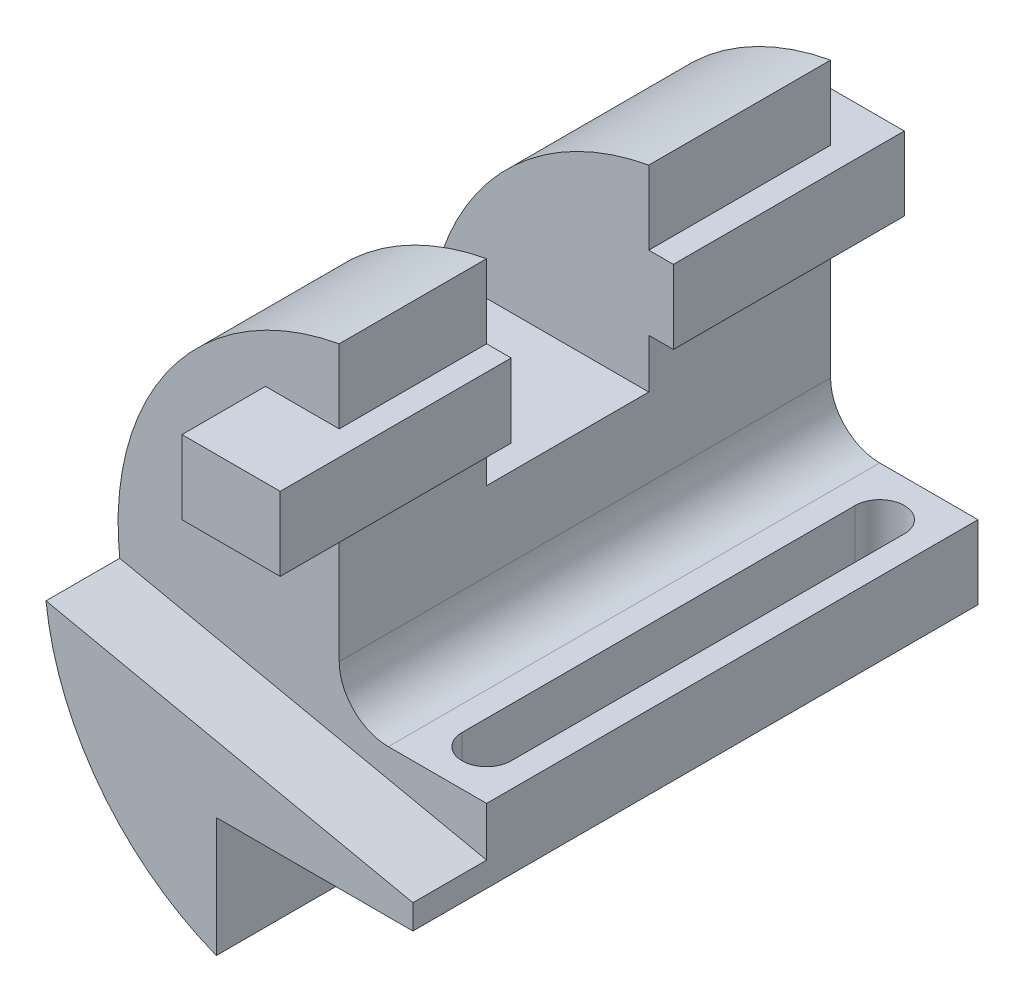
ISO-10303-21;
HEADER;
FILE_DESCRIPTION(('STEP AP214'),'2;1');
FILE_NAME('part.step','',(''),(''),'','','');
FILE_SCHEMA(('AUTOMOTIVE_DESIGN { 1 0 10303 214 1 1 1 1 }'));
ENDSEC;
DATA;
#1=APPLICATION_CONTEXT('core data for automotive mechanical design processes');
#2=APPLICATION_PROTOCOL_DEFINITION('international standard','automotive_design',2000,#1);
#3=PRODUCT_CONTEXT('',#1,'mechanical');
#4=PRODUCT('Part','Part','',(#3));
#5=PRODUCT_RELATED_PRODUCT_CATEGORY('part','',(#4));
#6=PRODUCT_DEFINITION_FORMATION('','',#4);
#7=PRODUCT_DEFINITION_CONTEXT('part definition',#1,'design');
#8=PRODUCT_DEFINITION('design','',#6,#7);
#9=PRODUCT_DEFINITION_SHAPE('','',#8);
#10=(LENGTH_UNIT() NAMED_UNIT(*) SI_UNIT(.MILLI.,.METRE.));
#11=(NAMED_UNIT(*) PLANE_ANGLE_UNIT() SI_UNIT($,.RADIAN.));
#12=(NAMED_UNIT(*) SI_UNIT($,.STERADIAN.) SOLID_ANGLE_UNIT());
#13=UNCERTAINTY_MEASURE_WITH_UNIT(LENGTH_MEASURE(1.E-05),#10,'distance_accuracy_value','');
#14=(GEOMETRIC_REPRESENTATION_CONTEXT(3) GLOBAL_UNCERTAINTY_ASSIGNED_CONTEXT((#13)) GLOBAL_UNIT_ASSIGNED_CONTEXT((#10,
#11,#12)) REPRESENTATION_CONTEXT('',''));
#15=CARTESIAN_POINT('',(0.,0.,0.));
#16=DIRECTION('',(0.,0.,1.));
#17=DIRECTION('',(1.,0.,0.));
#18=AXIS2_PLACEMENT_3D('',#15,#16,#17);
#19=CARTESIAN_POINT('',(-10.,-1.91673086804009,115.));
#20=DIRECTION('',(-1.,0.,0.));
#21=DIRECTION('',(0.,-1.,0.));
#22=AXIS2_PLACEMENT_3D('',#19,#20,#21);
#23=PLANE('',#22);
#24=DIRECTION('',(0.,1.,0.));
#25=VECTOR('',#24,1.);
#26=CARTESIAN_POINT('',(-10.,54.0832691319598,100.));
#27=LINE('',#26,#25);
#28=CARTESIAN_POINT('',(-10.,39.0832691319598,100.));
#29=VERTEX_POINT('',#28);
#30=CARTESIAN_POINT('',(-10.,54.0832691319598,100.));
#31=VERTEX_POINT('',#30);
#32=EDGE_CURVE('E380',#29,#31,#27,.T.);
#33=ORIENTED_EDGE('',*,*,#32,.F.);
#34=DIRECTION('',(0.,0.,-1.));
#35=VECTOR('',#34,1.);
#36=CARTESIAN_POINT('',(-10.,39.0832691319598,115.));
#37=LINE('',#36,#35);
#38=CARTESIAN_POINT('',(-10.,39.0832691319598,70.));
#39=VERTEX_POINT('',#38);
#40=EDGE_CURVE('E269',#29,#39,#37,.T.);
#41=ORIENTED_EDGE('',*,*,#40,.T.);
#42=DIRECTION('',(0.,-1.,0.));
#43=VECTOR('',#42,1.);
#44=CARTESIAN_POINT('',(-10.,54.0832691319598,70.));
#45=LINE('',#44,#43);
#46=CARTESIAN_POINT('',(-10.,54.0832691319598,70.));
#47=VERTEX_POINT('',#46);
#48=EDGE_CURVE('E311',#47,#39,#45,.T.);
#49=ORIENTED_EDGE('',*,*,#48,.F.);
#50=DIRECTION('',(0.,0.,-1.));
#51=VECTOR('',#50,1.);
#52=CARTESIAN_POINT('',(-10.,54.0832691319598,115.));
#53=LINE('',#52,#51);
#54=EDGE_CURVE('E420',#31,#47,#53,.T.);
#55=ORIENTED_EDGE('',*,*,#54,.F.);
#56=EDGE_LOOP('',(#33,#41,#49,#55));
#57=FACE_BOUND('',#56,.T.);
#58=ADVANCED_FACE('F39',(#57),#23,.F.);
#59=DIRECTION('',(0.,1.,0.));
#60=VECTOR('',#59,1.);
#61=CARTESIAN_POINT('',(-10.,54.0832691319598,37.));
#62=LINE('',#61,#60);
#63=CARTESIAN_POINT('',(-10.,39.0832691319598,37.));
#64=VERTEX_POINT('',#63);
#65=CARTESIAN_POINT('',(-10.,54.0832691319598,37.));
#66=VERTEX_POINT('',#65);
#67=EDGE_CURVE('E317',#64,#66,#62,.T.);
#68=ORIENTED_EDGE('',*,*,#67,.F.);
#69=DIRECTION('',(0.,0.,-1.));
#70=VECTOR('',#69,1.);
#71=CARTESIAN_POINT('',(-10.,39.0832691319598,115.));
#72=LINE('',#71,#70);
#73=CARTESIAN_POINT('',(-10.,39.0832691319598,0.));
#74=VERTEX_POINT('',#73);
#75=EDGE_CURVE('E308',#64,#74,#72,.T.);
#76=ORIENTED_EDGE('',*,*,#75,.T.);
#77=DIRECTION('',(0.,1.,0.));
#78=VECTOR('',#77,1.);
#79=CARTESIAN_POINT('',(-10.,-1.91673086804009,0.));
#80=LINE('',#79,#78);
#81=CARTESIAN_POINT('',(-10.,54.0832691319598,0.));
#82=VERTEX_POINT('',#81);
#83=EDGE_CURVE('E417',#74,#82,#80,.T.);
#84=ORIENTED_EDGE('',*,*,#83,.T.);
#85=EDGE_CURVE('E401',#66,#82,#53,.T.);
#86=ORIENTED_EDGE('',*,*,#85,.F.);
#87=EDGE_LOOP('',(#68,#76,#84,#86));
#88=FACE_BOUND('',#87,.T.);
#89=ADVANCED_FACE('F515',(#88),#23,.F.);
#90=CARTESIAN_POINT('',(0.,0.,115.));
#91=DIRECTION('',(0.,0.,-1.));
#92=DIRECTION('',(-1.,0.,0.));
#93=AXIS2_PLACEMENT_3D('',#90,#91,#92);
#94=CYLINDRICAL_SURFACE('',#93,55.);
#95=ORIENTED_EDGE('',*,*,#54,.T.);
#96=CARTESIAN_POINT('',(0.,0.,70.));
#97=DIRECTION('',(0.,0.,1.));
#98=DIRECTION('',(1.,0.,0.));
#99=AXIS2_PLACEMENT_3D('',#96,#97,#98);
#100=CIRCLE('',#99,55.);
#101=CARTESIAN_POINT('',(-53.166357130772,14.0832691319598,70.));
#102=VERTEX_POINT('',#101);
#103=EDGE_CURVE('E332',#47,#102,#100,.T.);
#104=ORIENTED_EDGE('',*,*,#103,.T.);
#105=DIRECTION('',(0.,0.,-1.));
#106=VECTOR('',#105,1.);
#107=CARTESIAN_POINT('',(-53.166357130772,14.0832691319598,115.));
#108=LINE('',#107,#106);
#109=CARTESIAN_POINT('',(-53.166357130772,14.0832691319598,37.));
#110=VERTEX_POINT('',#109);
#111=EDGE_CURVE('E324',#102,#110,#108,.T.);
#112=ORIENTED_EDGE('',*,*,#111,.T.);
#113=CARTESIAN_POINT('',(0.,0.,37.));
#114=DIRECTION('',(0.,0.,-1.));
#115=DIRECTION('',(0.,1.,0.));
#116=AXIS2_PLACEMENT_3D('',#113,#114,#115);
#117=CIRCLE('',#116,55.);
#118=EDGE_CURVE('E329',#110,#66,#117,.T.);
#119=ORIENTED_EDGE('',*,*,#118,.T.);
#120=ORIENTED_EDGE('',*,*,#85,.T.);
#121=CARTESIAN_POINT('',(0.,0.,0.));
#122=DIRECTION('',(0.,0.,1.));
#123=DIRECTION('',(1.,0.,0.));
#124=AXIS2_PLACEMENT_3D('',#121,#122,#123);
#125=CIRCLE('',#124,55.);
#126=CARTESIAN_POINT('',(-20.,-51.234753829798,0.));
#127=VERTEX_POINT('',#126);
#128=EDGE_CURVE('E389',#82,#127,#125,.T.);
#129=ORIENTED_EDGE('',*,*,#128,.T.);
#130=DIRECTION('',(0.,0.,-1.));
#131=VECTOR('',#130,1.);
#132=CARTESIAN_POINT('',(-20.,-51.234753829798,115.));
#133=LINE('',#132,#131);
#134=CARTESIAN_POINT('',(-20.,-51.234753829798,115.));
#135=VERTEX_POINT('',#134);
#136=EDGE_CURVE('E11',#135,#127,#133,.T.);
#137=ORIENTED_EDGE('',*,*,#136,.F.);
#138=CARTESIAN_POINT('',(0.,0.,115.));
#139=DIRECTION('',(0.,0.,1.));
#140=DIRECTION('',(1.,0.,0.));
#141=AXIS2_PLACEMENT_3D('',#138,#139,#140);
#142=CIRCLE('',#141,55.);
#143=CARTESIAN_POINT('',(-54.6666981663272,-6.04583423455199,115.));
#144=VERTEX_POINT('',#143);
#145=EDGE_CURVE('E391',#144,#135,#142,.T.);
#146=ORIENTED_EDGE('',*,*,#145,.F.);
#147=DIRECTION('',(0.,0.,1.));
#148=VECTOR('',#147,1.);
#149=CARTESIAN_POINT('',(-54.6666981663272,-6.04583423455199,100.));
#150=LINE('',#149,#148);
#151=CARTESIAN_POINT('',(-54.6666981663272,-6.04583423455199,100.));
#152=VERTEX_POINT('',#151);
#153=EDGE_CURVE('E384',#152,#144,#150,.T.);
#154=ORIENTED_EDGE('',*,*,#153,.F.);
#155=CARTESIAN_POINT('',(2.0122792321331E-13,-1.49186218934005E-13,100.));
#156=DIRECTION('',(0.,0.,1.));
#157=DIRECTION('',(-1.,0.,0.));
#158=AXIS2_PLACEMENT_3D('',#155,#156,#157);
#159=CIRCLE('',#158,55.0000000000002);
#160=EDGE_CURVE('E368',#31,#152,#159,.T.);
#161=ORIENTED_EDGE('',*,*,#160,.F.);
#162=EDGE_LOOP('',(#95,#104,#112,#119,#120,#129,#137,#146,#154,#161));
#163=FACE_BOUND('',#162,.T.);
#164=ADVANCED_FACE('F41',(#163),#94,.T.);
#165=CARTESIAN_POINT('',(-20.,-51.234753829798,115.));
#166=DIRECTION('',(-1.,0.,0.));
#167=DIRECTION('',(0.,-1.,0.));
#168=AXIS2_PLACEMENT_3D('',#165,#166,#167);
#169=PLANE('',#168);
#170=DIRECTION('',(0.,1.,0.));
#171=VECTOR('',#170,1.);
#172=CARTESIAN_POINT('',(-20.,-51.234753829798,0.));
#173=LINE('',#172,#171);
#174=CARTESIAN_POINT('',(-20.,-26.9167308680402,0.));
#175=VERTEX_POINT('',#174);
#176=EDGE_CURVE('E404',#127,#175,#173,.T.);
#177=ORIENTED_EDGE('',*,*,#176,.T.);
#178=DIRECTION('',(0.,0.,-1.));
#179=VECTOR('',#178,1.);
#180=CARTESIAN_POINT('',(-20.,-26.9167308680402,115.));
#181=LINE('',#180,#179);
#182=CARTESIAN_POINT('',(-20.,-26.9167308680402,115.));
#183=VERTEX_POINT('',#182);
#184=EDGE_CURVE('E47',#183,#175,#181,.T.);
#185=ORIENTED_EDGE('',*,*,#184,.F.);
#186=DIRECTION('',(0.,1.,0.));
#187=VECTOR('',#186,1.);
#188=CARTESIAN_POINT('',(-20.,-51.234753829798,115.));
#189=LINE('',#188,#187);
#190=EDGE_CURVE('E393',#135,#183,#189,.T.);
#191=ORIENTED_EDGE('',*,*,#190,.F.);
#192=ORIENTED_EDGE('',*,*,#136,.T.);
#193=EDGE_LOOP('',(#177,#185,#191,#192));
#194=FACE_BOUND('',#193,.T.);
#195=ADVANCED_FACE('F457',(#194),#169,.F.);
#196=CARTESIAN_POINT('',(-20.,-26.9167308680402,115.));
#197=DIRECTION('',(0.,1.,0.));
#198=DIRECTION('',(-1.,0.,0.));
#199=AXIS2_PLACEMENT_3D('',#196,#197,#198);
#200=PLANE('',#199);
#201=DIRECTION('',(0.,0.,-1.));
#202=VECTOR('',#201,1.);
#203=CARTESIAN_POINT('',(15.,-26.9167308680402,115.));
#204=LINE('',#203,#202);
#205=CARTESIAN_POINT('',(15.,-26.9167308680402,90.));
#206=VERTEX_POINT('',#205);
#207=CARTESIAN_POINT('',(15.,-26.9167308680402,10.));
#208=VERTEX_POINT('',#207);
#209=EDGE_CURVE('E361',#206,#208,#204,.T.);
#210=ORIENTED_EDGE('',*,*,#209,.T.);
#211=CARTESIAN_POINT('',(10.,-26.9167308680402,10.));
#212=DIRECTION('',(0.,1.,0.));
#213=DIRECTION('',(-1.,0.,0.));
#214=AXIS2_PLACEMENT_3D('',#211,#212,#213);
#215=CIRCLE('',#214,5.);
#216=CARTESIAN_POINT('',(4.99999999999999,-26.9167308680402,10.));
#217=VERTEX_POINT('',#216);
#218=EDGE_CURVE('E364',#208,#217,#215,.T.);
#219=ORIENTED_EDGE('',*,*,#218,.T.);
#220=DIRECTION('',(0.,0.,1.));
#221=VECTOR('',#220,1.);
#222=CARTESIAN_POINT('',(5.00000000000001,-26.9167308680402,115.));
#223=LINE('',#222,#221);
#224=CARTESIAN_POINT('',(5.,-26.9167308680402,90.));
#225=VERTEX_POINT('',#224);
#226=EDGE_CURVE('E349',#217,#225,#223,.T.);
#227=ORIENTED_EDGE('',*,*,#226,.T.);
#228=CARTESIAN_POINT('',(10.,-26.9167308680402,90.));
#229=DIRECTION('',(0.,1.,0.));
#230=DIRECTION('',(-1.,0.,0.));
#231=AXIS2_PLACEMENT_3D('',#228,#229,#230);
#232=CIRCLE('',#231,5.);
#233=EDGE_CURVE('E358',#225,#206,#232,.T.);
#234=ORIENTED_EDGE('',*,*,#233,.T.);
#235=EDGE_LOOP('',(#210,#219,#227,#234));
#236=FACE_BOUND('',#235,.T.);
#237=DIRECTION('',(1.,0.,0.));
#238=VECTOR('',#237,1.);
#239=CARTESIAN_POINT('',(-20.,-26.9167308680402,0.));
#240=LINE('',#239,#238);
#241=CARTESIAN_POINT('',(20.,-26.9167308680402,0.));
#242=VERTEX_POINT('',#241);
#243=EDGE_CURVE('E406',#175,#242,#240,.T.);
#244=ORIENTED_EDGE('',*,*,#243,.T.);
#245=DIRECTION('',(0.,0.,-1.));
#246=VECTOR('',#245,1.);
#247=CARTESIAN_POINT('',(20.,-26.9167308680402,115.));
#248=LINE('',#247,#246);
#249=CARTESIAN_POINT('',(20.,-26.9167308680402,115.));
#250=VERTEX_POINT('',#249);
#251=EDGE_CURVE('E429',#250,#242,#248,.T.);
#252=ORIENTED_EDGE('',*,*,#251,.F.);
#253=DIRECTION('',(1.,0.,0.));
#254=VECTOR('',#253,1.);
#255=CARTESIAN_POINT('',(-20.,-26.9167308680402,115.));
#256=LINE('',#255,#254);
#257=EDGE_CURVE('E396',#183,#250,#256,.T.);
#258=ORIENTED_EDGE('',*,*,#257,.F.);
#259=ORIENTED_EDGE('',*,*,#184,.T.);
#260=EDGE_LOOP('',(#244,#252,#258,#259));
#261=FACE_BOUND('',#260,.T.);
#262=ADVANCED_FACE('F436',(#236,#261),#200,.F.);
#263=CARTESIAN_POINT('',(20.,-26.9167308680402,115.));
#264=DIRECTION('',(-1.,0.,0.));
#265=DIRECTION('',(0.,0.,1.));
#266=AXIS2_PLACEMENT_3D('',#263,#264,#265);
#267=PLANE('',#266);
#268=DIRECTION('',(0.,1.,0.));
#269=VECTOR('',#268,1.);
#270=CARTESIAN_POINT('',(20.,-11.9167308680402,100.));
#271=LINE('',#270,#269);
#272=CARTESIAN_POINT('',(20.,-21.9167308680402,100.));
#273=VERTEX_POINT('',#272);
#274=CARTESIAN_POINT('',(20.,-11.9167308680402,100.));
#275=VERTEX_POINT('',#274);
#276=EDGE_CURVE('E374',#273,#275,#271,.T.);
#277=ORIENTED_EDGE('',*,*,#276,.F.);
#278=DIRECTION('',(0.,0.,1.));
#279=VECTOR('',#278,1.);
#280=CARTESIAN_POINT('',(20.,-21.9167308680402,100.));
#281=LINE('',#280,#279);
#282=CARTESIAN_POINT('',(20.,-21.9167308680402,115.));
#283=VERTEX_POINT('',#282);
#284=EDGE_CURVE('E386',#273,#283,#281,.T.);
#285=ORIENTED_EDGE('',*,*,#284,.T.);
#286=DIRECTION('',(0.,1.,0.));
#287=VECTOR('',#286,1.);
#288=CARTESIAN_POINT('',(20.,-26.9167308680402,115.));
#289=LINE('',#288,#287);
#290=EDGE_CURVE('E398',#250,#283,#289,.T.);
#291=ORIENTED_EDGE('',*,*,#290,.F.);
#292=ORIENTED_EDGE('',*,*,#251,.T.);
#293=DIRECTION('',(0.,1.,0.));
#294=VECTOR('',#293,1.);
#295=CARTESIAN_POINT('',(20.,-26.9167308680402,0.));
#296=LINE('',#295,#294);
#297=CARTESIAN_POINT('',(20.,-11.9167308680402,0.));
#298=VERTEX_POINT('',#297);
#299=EDGE_CURVE('E408',#242,#298,#296,.T.);
#300=ORIENTED_EDGE('',*,*,#299,.T.);
#301=DIRECTION('',(0.,0.,-1.));
#302=VECTOR('',#301,1.);
#303=CARTESIAN_POINT('',(20.,-11.9167308680402,115.));
#304=LINE('',#303,#302);
#305=EDGE_CURVE('E427',#275,#298,#304,.T.);
#306=ORIENTED_EDGE('',*,*,#305,.F.);
#307=EDGE_LOOP('',(#277,#285,#291,#292,#300,#306));
#308=FACE_BOUND('',#307,.T.);
#309=ADVANCED_FACE('F450',(#308),#267,.F.);
#310=CARTESIAN_POINT('',(20.,-11.9167308680402,115.));
#311=DIRECTION('',(0.,-1.,0.));
#312=DIRECTION('',(1.,0.,0.));
#313=AXIS2_PLACEMENT_3D('',#310,#311,#312);
#314=PLANE('',#313);
#315=DIRECTION('',(0.,0.,1.));
#316=VECTOR('',#315,1.);
#317=CARTESIAN_POINT('',(4.99999999999999,-11.9167308680402,10.));
#318=LINE('',#317,#316);
#319=CARTESIAN_POINT('',(4.99999999999999,-11.9167308680402,10.));
#320=VERTEX_POINT('',#319);
#321=CARTESIAN_POINT('',(5.,-11.9167308680402,90.));
#322=VERTEX_POINT('',#321);
#323=EDGE_CURVE('E337',#320,#322,#318,.T.);
#324=ORIENTED_EDGE('',*,*,#323,.F.);
#325=CARTESIAN_POINT('',(10.,-11.9167308680402,10.));
#326=DIRECTION('',(0.,1.,0.));
#327=DIRECTION('',(-1.,0.,0.));
#328=AXIS2_PLACEMENT_3D('',#325,#326,#327);
#329=CIRCLE('',#328,5.);
#330=CARTESIAN_POINT('',(15.,-11.9167308680402,10.));
#331=VERTEX_POINT('',#330);
#332=EDGE_CURVE('E335',#331,#320,#329,.T.);
#333=ORIENTED_EDGE('',*,*,#332,.F.);
#334=DIRECTION('',(0.,0.,-1.));
#335=VECTOR('',#334,1.);
#336=CARTESIAN_POINT('',(15.,-11.9167308680402,10.));
#337=LINE('',#336,#335);
#338=CARTESIAN_POINT('',(15.,-11.9167308680402,90.));
#339=VERTEX_POINT('',#338);
#340=EDGE_CURVE('E343',#339,#331,#337,.T.);
#341=ORIENTED_EDGE('',*,*,#340,.F.);
#342=CARTESIAN_POINT('',(10.,-11.9167308680402,90.));
#343=DIRECTION('',(0.,1.,0.));
#344=DIRECTION('',(-1.,0.,0.));
#345=AXIS2_PLACEMENT_3D('',#342,#343,#344);
#346=CIRCLE('',#345,5.);
#347=EDGE_CURVE('E340',#322,#339,#346,.T.);
#348=ORIENTED_EDGE('',*,*,#347,.F.);
#349=EDGE_LOOP('',(#324,#333,#341,#348));
#350=FACE_BOUND('',#349,.T.);
#351=DIRECTION('',(0.,0.,-1.));
#352=VECTOR('',#351,1.);
#353=CARTESIAN_POINT('',(0.,-11.9167308680402,115.));
#354=LINE('',#353,#352);
#355=CARTESIAN_POINT('',(0.,-11.9167308680402,100.));
#356=VERTEX_POINT('',#355);
#357=CARTESIAN_POINT('',(0.,-11.9167308680402,0.));
#358=VERTEX_POINT('',#357);
#359=EDGE_CURVE('E425',#356,#358,#354,.T.);
#360=ORIENTED_EDGE('',*,*,#359,.F.);
#361=DIRECTION('',(-1.,0.,0.));
#362=VECTOR('',#361,1.);
#363=CARTESIAN_POINT('',(0.,-11.9167308680402,100.));
#364=LINE('',#363,#362);
#365=EDGE_CURVE('E376',#275,#356,#364,.T.);
#366=ORIENTED_EDGE('',*,*,#365,.F.);
#367=ORIENTED_EDGE('',*,*,#305,.T.);
#368=DIRECTION('',(-1.,0.,0.));
#369=VECTOR('',#368,1.);
#370=CARTESIAN_POINT('',(20.,-11.9167308680402,0.));
#371=LINE('',#370,#369);
#372=EDGE_CURVE('E411',#298,#358,#371,.T.);
#373=ORIENTED_EDGE('',*,*,#372,.T.);
#374=EDGE_LOOP('',(#360,#366,#367,#373));
#375=FACE_BOUND('',#374,.T.);
#376=ADVANCED_FACE('F532',(#350,#375),#314,.F.);
#377=CARTESIAN_POINT('',(0.,-1.91673086804016,115.));
#378=DIRECTION('',(0.,0.,-1.));
#379=DIRECTION('',(-1.,0.,0.));
#380=AXIS2_PLACEMENT_3D('',#377,#378,#379);
#381=CYLINDRICAL_SURFACE('',#380,10.);
#382=DIRECTION('',(0.,0.,-1.));
#383=VECTOR('',#382,1.);
#384=CARTESIAN_POINT('',(-10.,-1.91673086804008,115.));
#385=LINE('',#384,#383);
#386=CARTESIAN_POINT('',(-10.,-1.91673086804009,100.));
#387=VERTEX_POINT('',#386);
#388=CARTESIAN_POINT('',(-10.,-1.91673086804008,0.));
#389=VERTEX_POINT('',#388);
#390=EDGE_CURVE('E423',#387,#389,#385,.T.);
#391=ORIENTED_EDGE('',*,*,#390,.F.);
#392=CARTESIAN_POINT('',(0.,-1.91673086804015,100.));
#393=DIRECTION('',(0.,0.,-1.));
#394=DIRECTION('',(1.,0.,0.));
#395=AXIS2_PLACEMENT_3D('',#392,#393,#394);
#396=CIRCLE('',#395,10.);
#397=EDGE_CURVE('E378',#356,#387,#396,.T.);
#398=ORIENTED_EDGE('',*,*,#397,.F.);
#399=ORIENTED_EDGE('',*,*,#359,.T.);
#400=CARTESIAN_POINT('',(0.,-1.91673086804016,0.));
#401=DIRECTION('',(0.,0.,-1.));
#402=DIRECTION('',(1.,0.,0.));
#403=AXIS2_PLACEMENT_3D('',#400,#401,#402);
#404=CIRCLE('',#403,10.);
#405=EDGE_CURVE('E414',#358,#389,#404,.T.);
#406=ORIENTED_EDGE('',*,*,#405,.T.);
#407=EDGE_LOOP('',(#391,#398,#399,#406));
#408=FACE_BOUND('',#407,.T.);
#409=ADVANCED_FACE('F525',(#408),#381,.F.);
#410=CARTESIAN_POINT('',(-10.,24.0832691319598,70.));
#411=VERTEX_POINT('',#410);
#412=CARTESIAN_POINT('',(-10.,14.0832691319598,70.));
#413=VERTEX_POINT('',#412);
#414=EDGE_CURVE('E310',#411,#413,#45,.T.);
#415=ORIENTED_EDGE('',*,*,#414,.F.);
#416=DIRECTION('',(0.,0.,1.));
#417=VECTOR('',#416,1.);
#418=CARTESIAN_POINT('',(-10.,24.0832691319598,115.));
#419=LINE('',#418,#417);
#420=CARTESIAN_POINT('',(-10.,24.0832691319598,100.));
#421=VERTEX_POINT('',#420);
#422=EDGE_CURVE('E266',#411,#421,#419,.T.);
#423=ORIENTED_EDGE('',*,*,#422,.T.);
#424=EDGE_CURVE('E381',#387,#421,#27,.T.);
#425=ORIENTED_EDGE('',*,*,#424,.F.);
#426=ORIENTED_EDGE('',*,*,#390,.T.);
#427=CARTESIAN_POINT('',(-10.,24.0832691319598,0.));
#428=VERTEX_POINT('',#427);
#429=EDGE_CURVE('E394',#389,#428,#80,.T.);
#430=ORIENTED_EDGE('',*,*,#429,.T.);
#431=DIRECTION('',(0.,0.,1.));
#432=VECTOR('',#431,1.);
#433=CARTESIAN_POINT('',(-10.,24.0832691319598,115.));
#434=LINE('',#433,#432);
#435=CARTESIAN_POINT('',(-10.,24.0832691319598,37.));
#436=VERTEX_POINT('',#435);
#437=EDGE_CURVE('E304',#428,#436,#434,.T.);
#438=ORIENTED_EDGE('',*,*,#437,.T.);
#439=CARTESIAN_POINT('',(-10.,14.0832691319598,37.));
#440=VERTEX_POINT('',#439);
#441=EDGE_CURVE('E318',#440,#436,#62,.T.);
#442=ORIENTED_EDGE('',*,*,#441,.F.);
#443=DIRECTION('',(0.,0.,-1.));
#444=VECTOR('',#443,1.);
#445=CARTESIAN_POINT('',(-10.,14.0832691319598,70.));
#446=LINE('',#445,#444);
#447=EDGE_CURVE('E314',#413,#440,#446,.T.);
#448=ORIENTED_EDGE('',*,*,#447,.F.);
#449=EDGE_LOOP('',(#415,#423,#425,#426,#430,#438,#442,#448));
#450=FACE_BOUND('',#449,.T.);
#451=ADVANCED_FACE('F484',(#450),#23,.F.);
#452=CARTESIAN_POINT('',(0.,0.,115.));
#453=DIRECTION('',(0.,0.,1.));
#454=DIRECTION('',(1.,0.,0.));
#455=AXIS2_PLACEMENT_3D('',#452,#453,#454);
#456=PLANE('',#455);
#457=DIRECTION('',(0.978147600733805,-0.207911690817763,0.));
#458=VECTOR('',#457,1.);
#459=CARTESIAN_POINT('',(-54.6666981663272,-6.04583423455199,115.));
#460=LINE('',#459,#458);
#461=EDGE_CURVE('E367',#144,#283,#460,.T.);
#462=ORIENTED_EDGE('',*,*,#461,.F.);
#463=ORIENTED_EDGE('',*,*,#145,.T.);
#464=ORIENTED_EDGE('',*,*,#190,.T.);
#465=ORIENTED_EDGE('',*,*,#257,.T.);
#466=ORIENTED_EDGE('',*,*,#290,.T.);
#467=EDGE_LOOP('',(#462,#463,#464,#465,#466));
#468=FACE_BOUND('',#467,.T.);
#469=ADVANCED_FACE('F454',(#468),#456,.T.);
#470=CARTESIAN_POINT('',(0.,0.,0.));
#471=DIRECTION('',(0.,0.,1.));
#472=DIRECTION('',(1.,0.,0.));
#473=AXIS2_PLACEMENT_3D('',#470,#471,#472);
#474=PLANE('',#473);
#475=ORIENTED_EDGE('',*,*,#83,.F.);
#476=DIRECTION('',(-1.,0.,0.));
#477=VECTOR('',#476,1.);
#478=CARTESIAN_POINT('',(0.,39.0832691319598,0.));
#479=LINE('',#478,#477);
#480=CARTESIAN_POINT('',(-25.,39.0832691319598,0.));
#481=VERTEX_POINT('',#480);
#482=EDGE_CURVE('E306',#74,#481,#479,.T.);
#483=ORIENTED_EDGE('',*,*,#482,.T.);
#484=DIRECTION('',(0.,1.,0.));
#485=VECTOR('',#484,1.);
#486=CARTESIAN_POINT('',(-25.,0.,0.));
#487=LINE('',#486,#485);
#488=CARTESIAN_POINT('',(-25.,24.0832691319598,0.));
#489=VERTEX_POINT('',#488);
#490=EDGE_CURVE('E294',#489,#481,#487,.T.);
#491=ORIENTED_EDGE('',*,*,#490,.F.);
#492=DIRECTION('',(1.,0.,0.));
#493=VECTOR('',#492,1.);
#494=CARTESIAN_POINT('',(0.,24.0832691319598,0.));
#495=LINE('',#494,#493);
#496=EDGE_CURVE('E302',#489,#428,#495,.T.);
#497=ORIENTED_EDGE('',*,*,#496,.T.);
#498=ORIENTED_EDGE('',*,*,#429,.F.);
#499=ORIENTED_EDGE('',*,*,#405,.F.);
#500=ORIENTED_EDGE('',*,*,#372,.F.);
#501=ORIENTED_EDGE('',*,*,#299,.F.);
#502=ORIENTED_EDGE('',*,*,#243,.F.);
#503=ORIENTED_EDGE('',*,*,#176,.F.);
#504=ORIENTED_EDGE('',*,*,#128,.F.);
#505=EDGE_LOOP('',(#475,#483,#491,#497,#498,#499,#500,#501,#502,#503,#504));
#506=FACE_BOUND('',#505,.T.);
#507=ADVANCED_FACE('F443',(#506),#474,.F.);
#508=CARTESIAN_POINT('',(-54.6666981663272,-6.04583423455199,100.));
#509=DIRECTION('',(-0.207911690817763,-0.978147600733805,0.));
#510=DIRECTION('',(0.978147600733805,-0.207911690817763,0.));
#511=AXIS2_PLACEMENT_3D('',#508,#509,#510);
#512=PLANE('',#511);
#513=ORIENTED_EDGE('',*,*,#461,.T.);
#514=ORIENTED_EDGE('',*,*,#284,.F.);
#515=DIRECTION('',(0.978147600733805,-0.207911690817763,0.));
#516=VECTOR('',#515,1.);
#517=CARTESIAN_POINT('',(-54.6666981663272,-6.04583423455199,100.));
#518=LINE('',#517,#516);
#519=EDGE_CURVE('E371',#152,#273,#518,.T.);
#520=ORIENTED_EDGE('',*,*,#519,.F.);
#521=ORIENTED_EDGE('',*,*,#153,.T.);
#522=EDGE_LOOP('',(#513,#514,#520,#521));
#523=FACE_BOUND('',#522,.T.);
#524=ADVANCED_FACE('F576',(#523),#512,.F.);
#525=CARTESIAN_POINT('',(2.0122792321331E-13,-1.49186218934005E-13,100.));
#526=DIRECTION('',(0.,0.,-1.));
#527=DIRECTION('',(-1.,0.,0.));
#528=AXIS2_PLACEMENT_3D('',#525,#526,#527);
#529=PLANE('',#528);
#530=DIRECTION('',(0.,-1.,0.));
#531=VECTOR('',#530,1.);
#532=CARTESIAN_POINT('',(-25.,-1.520774247273E-13,100.));
#533=LINE('',#532,#531);
#534=CARTESIAN_POINT('',(-25.,39.0832691319598,100.));
#535=VERTEX_POINT('',#534);
#536=CARTESIAN_POINT('',(-25.,24.0832691319598,100.));
#537=VERTEX_POINT('',#536);
#538=EDGE_CURVE('E54',#535,#537,#533,.T.);
#539=ORIENTED_EDGE('',*,*,#538,.F.);
#540=DIRECTION('',(1.,0.,0.));
#541=VECTOR('',#540,1.);
#542=CARTESIAN_POINT('',(2.00017232776147E-13,39.0832691319598,100.));
#543=LINE('',#542,#541);
#544=EDGE_CURVE('E58',#535,#29,#543,.T.);
#545=ORIENTED_EDGE('',*,*,#544,.T.);
#546=ORIENTED_EDGE('',*,*,#32,.T.);
#547=ORIENTED_EDGE('',*,*,#160,.T.);
#548=ORIENTED_EDGE('',*,*,#519,.T.);
#549=ORIENTED_EDGE('',*,*,#276,.T.);
#550=ORIENTED_EDGE('',*,*,#365,.T.);
#551=ORIENTED_EDGE('',*,*,#397,.T.);
#552=ORIENTED_EDGE('',*,*,#424,.T.);
#553=DIRECTION('',(-1.,0.,0.));
#554=VECTOR('',#553,1.);
#555=CARTESIAN_POINT('',(2.00481890850069E-13,24.0832691319598,100.));
#556=LINE('',#555,#554);
#557=EDGE_CURVE('E264',#421,#537,#556,.T.);
#558=ORIENTED_EDGE('',*,*,#557,.T.);
#559=EDGE_LOOP('',(#539,#545,#546,#547,#548,#549,#550,#551,#552,#558));
#560=FACE_BOUND('',#559,.T.);
#561=ADVANCED_FACE('F682',(#560),#529,.F.);
#562=CARTESIAN_POINT('',(10.,-69.9167308680402,10.));
#563=DIRECTION('',(0.,1.,0.));
#564=DIRECTION('',(-1.,0.,0.));
#565=AXIS2_PLACEMENT_3D('',#562,#563,#564);
#566=CYLINDRICAL_SURFACE('',#565,5.);
#567=DIRECTION('',(0.,1.,0.));
#568=VECTOR('',#567,1.);
#569=CARTESIAN_POINT('',(15.,-69.9167308680402,10.));
#570=LINE('',#569,#568);
#571=EDGE_CURVE('E347',#208,#331,#570,.T.);
#572=ORIENTED_EDGE('',*,*,#571,.T.);
#573=ORIENTED_EDGE('',*,*,#332,.T.);
#574=DIRECTION('',(0.,1.,0.));
#575=VECTOR('',#574,1.);
#576=CARTESIAN_POINT('',(5.,-69.9167308680402,10.));
#577=LINE('',#576,#575);
#578=EDGE_CURVE('E346',#217,#320,#577,.T.);
#579=ORIENTED_EDGE('',*,*,#578,.F.);
#580=ORIENTED_EDGE('',*,*,#218,.F.);
#581=EDGE_LOOP('',(#572,#573,#579,#580));
#582=FACE_BOUND('',#581,.T.);
#583=ADVANCED_FACE('F674',(#582),#566,.F.);
#584=CARTESIAN_POINT('',(15.,-69.9167308680402,10.));
#585=DIRECTION('',(1.,0.,0.));
#586=DIRECTION('',(0.,0.,-1.));
#587=AXIS2_PLACEMENT_3D('',#584,#585,#586);
#588=PLANE('',#587);
#589=DIRECTION('',(0.,1.,0.));
#590=VECTOR('',#589,1.);
#591=CARTESIAN_POINT('',(15.,-69.9167308680402,90.));
#592=LINE('',#591,#590);
#593=EDGE_CURVE('E350',#206,#339,#592,.T.);
#594=ORIENTED_EDGE('',*,*,#593,.T.);
#595=ORIENTED_EDGE('',*,*,#340,.T.);
#596=ORIENTED_EDGE('',*,*,#571,.F.);
#597=ORIENTED_EDGE('',*,*,#209,.F.);
#598=EDGE_LOOP('',(#594,#595,#596,#597));
#599=FACE_BOUND('',#598,.T.);
#600=ADVANCED_FACE('F670',(#599),#588,.F.);
#601=CARTESIAN_POINT('',(10.,-69.9167308680402,90.));
#602=DIRECTION('',(0.,1.,0.));
#603=DIRECTION('',(-1.,0.,0.));
#604=AXIS2_PLACEMENT_3D('',#601,#602,#603);
#605=CYLINDRICAL_SURFACE('',#604,5.);
#606=DIRECTION('',(0.,1.,0.));
#607=VECTOR('',#606,1.);
#608=CARTESIAN_POINT('',(5.00000000000001,-69.9167308680402,90.));
#609=LINE('',#608,#607);
#610=EDGE_CURVE('E352',#225,#322,#609,.T.);
#611=ORIENTED_EDGE('',*,*,#610,.T.);
#612=ORIENTED_EDGE('',*,*,#347,.T.);
#613=ORIENTED_EDGE('',*,*,#593,.F.);
#614=ORIENTED_EDGE('',*,*,#233,.F.);
#615=EDGE_LOOP('',(#611,#612,#613,#614));
#616=FACE_BOUND('',#615,.T.);
#617=ADVANCED_FACE('F673',(#616),#605,.F.);
#618=CARTESIAN_POINT('',(5.,-69.9167308680402,10.));
#619=DIRECTION('',(-1.,0.,0.));
#620=DIRECTION('',(0.,0.,1.));
#621=AXIS2_PLACEMENT_3D('',#618,#619,#620);
#622=PLANE('',#621);
#623=ORIENTED_EDGE('',*,*,#578,.T.);
#624=ORIENTED_EDGE('',*,*,#323,.T.);
#625=ORIENTED_EDGE('',*,*,#610,.F.);
#626=ORIENTED_EDGE('',*,*,#226,.F.);
#627=EDGE_LOOP('',(#623,#624,#625,#626));
#628=FACE_BOUND('',#627,.T.);
#629=ADVANCED_FACE('F556',(#628),#622,.F.);
#630=CARTESIAN_POINT('',(-68.,54.0832691319598,70.));
#631=DIRECTION('',(0.,0.,1.));
#632=DIRECTION('',(1.,0.,0.));
#633=AXIS2_PLACEMENT_3D('',#630,#631,#632);
#634=PLANE('',#633);
#635=ORIENTED_EDGE('',*,*,#48,.T.);
#636=DIRECTION('',(1.,0.,0.));
#637=VECTOR('',#636,1.);
#638=CARTESIAN_POINT('',(-25.,39.0832691319598,70.));
#639=LINE('',#638,#637);
#640=CARTESIAN_POINT('',(-5.,39.0832691319598,70.));
#641=VERTEX_POINT('',#640);
#642=EDGE_CURVE('E260',#39,#641,#639,.T.);
#643=ORIENTED_EDGE('',*,*,#642,.T.);
#644=DIRECTION('',(0.,1.,0.));
#645=VECTOR('',#644,1.);
#646=CARTESIAN_POINT('',(-5.,39.0832691319598,70.));
#647=LINE('',#646,#645);
#648=CARTESIAN_POINT('',(-5.,24.0832691319598,70.));
#649=VERTEX_POINT('',#648);
#650=EDGE_CURVE('E244',#649,#641,#647,.T.);
#651=ORIENTED_EDGE('',*,*,#650,.F.);
#652=DIRECTION('',(1.,0.,0.));
#653=VECTOR('',#652,1.);
#654=CARTESIAN_POINT('',(-25.,24.0832691319598,70.));
#655=LINE('',#654,#653);
#656=EDGE_CURVE('E233',#411,#649,#655,.T.);
#657=ORIENTED_EDGE('',*,*,#656,.F.);
#658=ORIENTED_EDGE('',*,*,#414,.T.);
#659=DIRECTION('',(1.,0.,0.));
#660=VECTOR('',#659,1.);
#661=CARTESIAN_POINT('',(-68.,14.0832691319598,70.));
#662=LINE('',#661,#660);
#663=EDGE_CURVE('E321',#102,#413,#662,.T.);
#664=ORIENTED_EDGE('',*,*,#663,.F.);
#665=ORIENTED_EDGE('',*,*,#103,.F.);
#666=EDGE_LOOP('',(#635,#643,#651,#657,#658,#664,#665));
#667=FACE_BOUND('',#666,.T.);
#668=ADVANCED_FACE('F496',(#667),#634,.F.);
#669=CARTESIAN_POINT('',(-68.,54.0832691319598,37.));
#670=DIRECTION('',(0.,0.,-1.));
#671=DIRECTION('',(0.,1.,0.));
#672=AXIS2_PLACEMENT_3D('',#669,#670,#671);
#673=PLANE('',#672);
#674=ORIENTED_EDGE('',*,*,#441,.T.);
#675=DIRECTION('',(1.,0.,0.));
#676=VECTOR('',#675,1.);
#677=CARTESIAN_POINT('',(-25.,24.0832691319598,37.));
#678=LINE('',#677,#676);
#679=CARTESIAN_POINT('',(-5.,24.0832691319598,37.));
#680=VERTEX_POINT('',#679);
#681=EDGE_CURVE('E291',#436,#680,#678,.T.);
#682=ORIENTED_EDGE('',*,*,#681,.T.);
#683=DIRECTION('',(0.,-1.,0.));
#684=VECTOR('',#683,1.);
#685=CARTESIAN_POINT('',(-5.,39.0832691319598,37.));
#686=LINE('',#685,#684);
#687=CARTESIAN_POINT('',(-5.,39.0832691319598,37.));
#688=VERTEX_POINT('',#687);
#689=EDGE_CURVE('E271',#688,#680,#686,.T.);
#690=ORIENTED_EDGE('',*,*,#689,.F.);
#691=DIRECTION('',(1.,0.,0.));
#692=VECTOR('',#691,1.);
#693=CARTESIAN_POINT('',(-25.,39.0832691319598,37.));
#694=LINE('',#693,#692);
#695=EDGE_CURVE('E292',#64,#688,#694,.T.);
#696=ORIENTED_EDGE('',*,*,#695,.F.);
#697=ORIENTED_EDGE('',*,*,#67,.T.);
#698=ORIENTED_EDGE('',*,*,#118,.F.);
#699=DIRECTION('',(1.,0.,0.));
#700=VECTOR('',#699,1.);
#701=CARTESIAN_POINT('',(-68.,14.0832691319598,37.));
#702=LINE('',#701,#700);
#703=EDGE_CURVE('E322',#110,#440,#702,.T.);
#704=ORIENTED_EDGE('',*,*,#703,.T.);
#705=EDGE_LOOP('',(#674,#682,#690,#696,#697,#698,#704));
#706=FACE_BOUND('',#705,.T.);
#707=ADVANCED_FACE('F487',(#706),#673,.F.);
#708=CARTESIAN_POINT('',(-68.,14.0832691319598,70.));
#709=DIRECTION('',(0.,-1.,0.));
#710=DIRECTION('',(1.,0.,0.));
#711=AXIS2_PLACEMENT_3D('',#708,#709,#710);
#712=PLANE('',#711);
#713=ORIENTED_EDGE('',*,*,#663,.T.);
#714=ORIENTED_EDGE('',*,*,#447,.T.);
#715=ORIENTED_EDGE('',*,*,#703,.F.);
#716=ORIENTED_EDGE('',*,*,#111,.F.);
#717=EDGE_LOOP('',(#713,#714,#715,#716));
#718=FACE_BOUND('',#717,.T.);
#719=ADVANCED_FACE('F491',(#718),#712,.F.);
#720=CARTESIAN_POINT('',(-25.,39.0832691319598,37.));
#721=DIRECTION('',(0.,1.,0.));
#722=DIRECTION('',(-1.,0.,0.));
#723=AXIS2_PLACEMENT_3D('',#720,#721,#722);
#724=PLANE('',#723);
#725=ORIENTED_EDGE('',*,*,#75,.F.);
#726=ORIENTED_EDGE('',*,*,#695,.T.);
#727=DIRECTION('',(0.,0.,1.));
#728=VECTOR('',#727,1.);
#729=CARTESIAN_POINT('',(-5.,39.0832691319598,37.));
#730=LINE('',#729,#728);
#731=CARTESIAN_POINT('',(-5.,39.0832691319598,-10.));
#732=VERTEX_POINT('',#731);
#733=EDGE_CURVE('E280',#732,#688,#730,.T.);
#734=ORIENTED_EDGE('',*,*,#733,.F.);
#735=DIRECTION('',(1.,0.,0.));
#736=VECTOR('',#735,1.);
#737=CARTESIAN_POINT('',(-25.,39.0832691319598,-10.));
#738=LINE('',#737,#736);
#739=CARTESIAN_POINT('',(-25.,39.0832691319598,-10.));
#740=VERTEX_POINT('',#739);
#741=EDGE_CURVE('E295',#740,#732,#738,.T.);
#742=ORIENTED_EDGE('',*,*,#741,.F.);
#743=DIRECTION('',(0.,0.,1.));
#744=VECTOR('',#743,1.);
#745=CARTESIAN_POINT('',(-25.,39.0832691319598,37.));
#746=LINE('',#745,#744);
#747=EDGE_CURVE('E288',#740,#481,#746,.T.);
#748=ORIENTED_EDGE('',*,*,#747,.T.);
#749=ORIENTED_EDGE('',*,*,#482,.F.);
#750=EDGE_LOOP('',(#725,#726,#734,#742,#748,#749));
#751=FACE_BOUND('',#750,.T.);
#752=ADVANCED_FACE('F466',(#751),#724,.T.);
#753=CARTESIAN_POINT('',(-25.,24.0832691319598,37.));
#754=DIRECTION('',(0.,-1.,0.));
#755=DIRECTION('',(1.,0.,0.));
#756=AXIS2_PLACEMENT_3D('',#753,#754,#755);
#757=PLANE('',#756);
#758=ORIENTED_EDGE('',*,*,#437,.F.);
#759=ORIENTED_EDGE('',*,*,#496,.F.);
#760=DIRECTION('',(0.,0.,-1.));
#761=VECTOR('',#760,1.);
#762=CARTESIAN_POINT('',(-25.,24.0832691319598,37.));
#763=LINE('',#762,#761);
#764=CARTESIAN_POINT('',(-25.,24.0832691319598,-10.));
#765=VERTEX_POINT('',#764);
#766=EDGE_CURVE('E283',#489,#765,#763,.T.);
#767=ORIENTED_EDGE('',*,*,#766,.T.);
#768=DIRECTION('',(1.,0.,0.));
#769=VECTOR('',#768,1.);
#770=CARTESIAN_POINT('',(-25.,24.0832691319598,-10.));
#771=LINE('',#770,#769);
#772=CARTESIAN_POINT('',(-5.,24.0832691319598,-10.));
#773=VERTEX_POINT('',#772);
#774=EDGE_CURVE('E297',#765,#773,#771,.T.);
#775=ORIENTED_EDGE('',*,*,#774,.T.);
#776=DIRECTION('',(0.,0.,-1.));
#777=VECTOR('',#776,1.);
#778=CARTESIAN_POINT('',(-5.,24.0832691319598,37.));
#779=LINE('',#778,#777);
#780=EDGE_CURVE('E274',#680,#773,#779,.T.);
#781=ORIENTED_EDGE('',*,*,#780,.F.);
#782=ORIENTED_EDGE('',*,*,#681,.F.);
#783=EDGE_LOOP('',(#758,#759,#767,#775,#781,#782));
#784=FACE_BOUND('',#783,.T.);
#785=ADVANCED_FACE('F478',(#784),#757,.T.);
#786=CARTESIAN_POINT('',(-25.,0.,0.));
#787=DIRECTION('',(1.,0.,0.));
#788=DIRECTION('',(0.,1.,0.));
#789=AXIS2_PLACEMENT_3D('',#786,#787,#788);
#790=PLANE('',#789);
#791=ORIENTED_EDGE('',*,*,#766,.F.);
#792=ORIENTED_EDGE('',*,*,#490,.T.);
#793=ORIENTED_EDGE('',*,*,#747,.F.);
#794=DIRECTION('',(0.,1.,0.));
#795=VECTOR('',#794,1.);
#796=CARTESIAN_POINT('',(-25.,39.0832691319598,-10.));
#797=LINE('',#796,#795);
#798=EDGE_CURVE('E285',#765,#740,#797,.T.);
#799=ORIENTED_EDGE('',*,*,#798,.F.);
#800=EDGE_LOOP('',(#791,#792,#793,#799));
#801=FACE_BOUND('',#800,.T.);
#802=ADVANCED_FACE('F473',(#801),#790,.F.);
#803=CARTESIAN_POINT('',(-25.,39.0832691319598,-10.));
#804=DIRECTION('',(0.,0.,-1.));
#805=DIRECTION('',(0.,1.,0.));
#806=AXIS2_PLACEMENT_3D('',#803,#804,#805);
#807=PLANE('',#806);
#808=ORIENTED_EDGE('',*,*,#741,.T.);
#809=DIRECTION('',(0.,1.,0.));
#810=VECTOR('',#809,1.);
#811=CARTESIAN_POINT('',(-5.,39.0832691319598,-10.));
#812=LINE('',#811,#810);
#813=EDGE_CURVE('E277',#773,#732,#812,.T.);
#814=ORIENTED_EDGE('',*,*,#813,.F.);
#815=ORIENTED_EDGE('',*,*,#774,.F.);
#816=ORIENTED_EDGE('',*,*,#798,.T.);
#817=EDGE_LOOP('',(#808,#814,#815,#816));
#818=FACE_BOUND('',#817,.T.);
#819=ADVANCED_FACE('F604',(#818),#807,.T.);
#820=CARTESIAN_POINT('',(-5.,0.,0.));
#821=DIRECTION('',(1.,0.,0.));
#822=DIRECTION('',(0.,1.,0.));
#823=AXIS2_PLACEMENT_3D('',#820,#821,#822);
#824=PLANE('',#823);
#825=ORIENTED_EDGE('',*,*,#689,.T.);
#826=ORIENTED_EDGE('',*,*,#780,.T.);
#827=ORIENTED_EDGE('',*,*,#813,.T.);
#828=ORIENTED_EDGE('',*,*,#733,.T.);
#829=EDGE_LOOP('',(#825,#826,#827,#828));
#830=FACE_BOUND('',#829,.T.);
#831=ADVANCED_FACE('F611',(#830),#824,.T.);
#832=CARTESIAN_POINT('',(-25.,39.0832691319598,117.));
#833=DIRECTION('',(0.,1.,0.));
#834=DIRECTION('',(-1.,0.,0.));
#835=AXIS2_PLACEMENT_3D('',#832,#833,#834);
#836=PLANE('',#835);
#837=ORIENTED_EDGE('',*,*,#40,.F.);
#838=ORIENTED_EDGE('',*,*,#544,.F.);
#839=DIRECTION('',(0.,0.,1.));
#840=VECTOR('',#839,1.);
#841=CARTESIAN_POINT('',(-25.,39.0832691319598,117.));
#842=LINE('',#841,#840);
#843=CARTESIAN_POINT('',(-25.,39.0832691319598,117.));
#844=VERTEX_POINT('',#843);
#845=EDGE_CURVE('E234',#535,#844,#842,.T.);
#846=ORIENTED_EDGE('',*,*,#845,.T.);
#847=DIRECTION('',(1.,0.,0.));
#848=VECTOR('',#847,1.);
#849=CARTESIAN_POINT('',(-25.,39.0832691319598,117.));
#850=LINE('',#849,#848);
#851=CARTESIAN_POINT('',(-5.,39.0832691319598,117.));
#852=VERTEX_POINT('',#851);
#853=EDGE_CURVE('E258',#844,#852,#850,.T.);
#854=ORIENTED_EDGE('',*,*,#853,.T.);
#855=DIRECTION('',(0.,0.,1.));
#856=VECTOR('',#855,1.);
#857=CARTESIAN_POINT('',(-5.,39.0832691319598,117.));
#858=LINE('',#857,#856);
#859=EDGE_CURVE('E249',#641,#852,#858,.T.);
#860=ORIENTED_EDGE('',*,*,#859,.F.);
#861=ORIENTED_EDGE('',*,*,#642,.F.);
#862=EDGE_LOOP('',(#837,#838,#846,#854,#860,#861));
#863=FACE_BOUND('',#862,.T.);
#864=ADVANCED_FACE('F500',(#863),#836,.T.);
#865=CARTESIAN_POINT('',(-25.,24.0832691319598,117.));
#866=DIRECTION('',(0.,-1.,0.));
#867=DIRECTION('',(1.,0.,0.));
#868=AXIS2_PLACEMENT_3D('',#865,#866,#867);
#869=PLANE('',#868);
#870=ORIENTED_EDGE('',*,*,#422,.F.);
#871=ORIENTED_EDGE('',*,*,#656,.T.);
#872=DIRECTION('',(0.,0.,-1.));
#873=VECTOR('',#872,1.);
#874=CARTESIAN_POINT('',(-5.,24.0832691319598,117.));
#875=LINE('',#874,#873);
#876=CARTESIAN_POINT('',(-5.,24.0832691319598,117.));
#877=VERTEX_POINT('',#876);
#878=EDGE_CURVE('E237',#877,#649,#875,.T.);
#879=ORIENTED_EDGE('',*,*,#878,.F.);
#880=DIRECTION('',(1.,0.,0.));
#881=VECTOR('',#880,1.);
#882=CARTESIAN_POINT('',(-25.,24.0832691319598,117.));
#883=LINE('',#882,#881);
#884=CARTESIAN_POINT('',(-25.,24.0832691319598,117.));
#885=VERTEX_POINT('',#884);
#886=EDGE_CURVE('E222',#885,#877,#883,.T.);
#887=ORIENTED_EDGE('',*,*,#886,.F.);
#888=DIRECTION('',(0.,0.,-1.));
#889=VECTOR('',#888,1.);
#890=CARTESIAN_POINT('',(-25.,24.0832691319598,117.));
#891=LINE('',#890,#889);
#892=EDGE_CURVE('E255',#885,#537,#891,.T.);
#893=ORIENTED_EDGE('',*,*,#892,.T.);
#894=ORIENTED_EDGE('',*,*,#557,.F.);
#895=EDGE_LOOP('',(#870,#871,#879,#887,#893,#894));
#896=FACE_BOUND('',#895,.T.);
#897=ADVANCED_FACE('F239',(#896),#869,.T.);
#898=CARTESIAN_POINT('',(-25.,0.,0.));
#899=DIRECTION('',(1.,0.,0.));
#900=DIRECTION('',(0.,1.,0.));
#901=AXIS2_PLACEMENT_3D('',#898,#899,#900);
#902=PLANE('',#901);
#903=ORIENTED_EDGE('',*,*,#845,.F.);
#904=ORIENTED_EDGE('',*,*,#538,.T.);
#905=ORIENTED_EDGE('',*,*,#892,.F.);
#906=DIRECTION('',(0.,-1.,0.));
#907=VECTOR('',#906,1.);
#908=CARTESIAN_POINT('',(-25.,39.0832691319598,117.));
#909=LINE('',#908,#907);
#910=EDGE_CURVE('E229',#844,#885,#909,.T.);
#911=ORIENTED_EDGE('',*,*,#910,.F.);
#912=EDGE_LOOP('',(#903,#904,#905,#911));
#913=FACE_BOUND('',#912,.T.);
#914=ADVANCED_FACE('F503',(#913),#902,.F.);
#915=CARTESIAN_POINT('',(-25.,39.0832691319598,117.));
#916=DIRECTION('',(0.,0.,1.));
#917=DIRECTION('',(1.,0.,0.));
#918=AXIS2_PLACEMENT_3D('',#915,#916,#917);
#919=PLANE('',#918);
#920=ORIENTED_EDGE('',*,*,#886,.T.);
#921=DIRECTION('',(0.,-1.,0.));
#922=VECTOR('',#921,1.);
#923=CARTESIAN_POINT('',(-5.,39.0832691319598,117.));
#924=LINE('',#923,#922);
#925=EDGE_CURVE('E227',#852,#877,#924,.T.);
#926=ORIENTED_EDGE('',*,*,#925,.F.);
#927=ORIENTED_EDGE('',*,*,#853,.F.);
#928=ORIENTED_EDGE('',*,*,#910,.T.);
#929=EDGE_LOOP('',(#920,#926,#927,#928));
#930=FACE_BOUND('',#929,.T.);
#931=ADVANCED_FACE('F224',(#930),#919,.T.);
#932=CARTESIAN_POINT('',(-5.,0.,0.));
#933=DIRECTION('',(1.,0.,0.));
#934=DIRECTION('',(0.,1.,0.));
#935=AXIS2_PLACEMENT_3D('',#932,#933,#934);
#936=PLANE('',#935);
#937=ORIENTED_EDGE('',*,*,#925,.T.);
#938=ORIENTED_EDGE('',*,*,#878,.T.);
#939=ORIENTED_EDGE('',*,*,#650,.T.);
#940=ORIENTED_EDGE('',*,*,#859,.T.);
#941=EDGE_LOOP('',(#937,#938,#939,#940));
#942=FACE_BOUND('',#941,.T.);
#943=ADVANCED_FACE('F247',(#942),#936,.T.);
#944=CLOSED_SHELL('',(#58,#89,#164,#195,#262,#309,#376,#409,#451,#469,#507,#524,#561,#583,#600,
#617,#629,#668,#707,#719,#752,#785,#802,#819,#831,#864,#897,#914,#931,#943));
#945=MANIFOLD_SOLID_BREP('B2',#944);
#946=ADVANCED_BREP_SHAPE_REPRESENTATION('',(#18,#945),#14);
#947=SHAPE_DEFINITION_REPRESENTATION(#9,#946);
ENDSEC;
END-ISO-10303-21;
